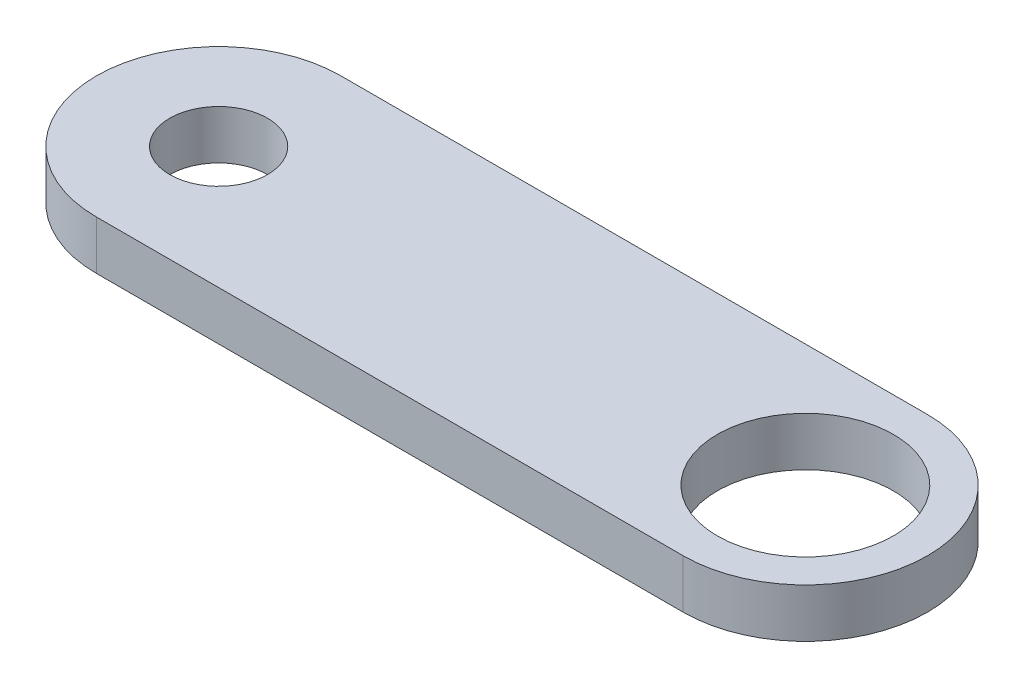
ISO-10303-21;
HEADER;
FILE_DESCRIPTION(('STEP AP214'),'2;1');
FILE_NAME('part.step','',(''),(''),'','','');
FILE_SCHEMA(('AUTOMOTIVE_DESIGN { 1 0 10303 214 1 1 1 1 }'));
ENDSEC;
DATA;
#1=APPLICATION_CONTEXT('core data for automotive mechanical design processes');
#2=APPLICATION_PROTOCOL_DEFINITION('international standard','automotive_design',2000,#1);
#3=PRODUCT_CONTEXT('',#1,'mechanical');
#4=PRODUCT('Part','Part','',(#3));
#5=PRODUCT_RELATED_PRODUCT_CATEGORY('part','',(#4));
#6=PRODUCT_DEFINITION_FORMATION('','',#4);
#7=PRODUCT_DEFINITION_CONTEXT('part definition',#1,'design');
#8=PRODUCT_DEFINITION('design','',#6,#7);
#9=PRODUCT_DEFINITION_SHAPE('','',#8);
#10=(LENGTH_UNIT() NAMED_UNIT(*) SI_UNIT(.MILLI.,.METRE.));
#11=(NAMED_UNIT(*) PLANE_ANGLE_UNIT() SI_UNIT($,.RADIAN.));
#12=(NAMED_UNIT(*) SI_UNIT($,.STERADIAN.) SOLID_ANGLE_UNIT());
#13=UNCERTAINTY_MEASURE_WITH_UNIT(LENGTH_MEASURE(1.E-05),#10,'distance_accuracy_value','');
#14=(GEOMETRIC_REPRESENTATION_CONTEXT(3) GLOBAL_UNCERTAINTY_ASSIGNED_CONTEXT((#13)) GLOBAL_UNIT_ASSIGNED_CONTEXT((#10,
#11,#12)) REPRESENTATION_CONTEXT('',''));
#15=CARTESIAN_POINT('',(0.,0.,0.));
#16=DIRECTION('',(0.,0.,1.));
#17=DIRECTION('',(1.,0.,0.));
#18=AXIS2_PLACEMENT_3D('',#15,#16,#17);
#19=CARTESIAN_POINT('',(0.,5.,0.));
#20=DIRECTION('',(0.,1.,0.));
#21=DIRECTION('',(0.,0.,1.));
#22=AXIS2_PLACEMENT_3D('',#19,#20,#21);
#23=PLANE('',#22);
#24=CARTESIAN_POINT('',(0.,5.,0.));
#25=DIRECTION('',(0.,1.,0.));
#26=DIRECTION('',(0.,0.,1.));
#27=AXIS2_PLACEMENT_3D('',#24,#25,#26);
#28=CIRCLE('',#27,5.);
#29=CARTESIAN_POINT('',(0.,5.,5.));
#30=VERTEX_POINT('',#29);
#31=EDGE_CURVE('E112',#30,#30,#28,.T.);
#32=ORIENTED_EDGE('',*,*,#31,.F.);
#33=EDGE_LOOP('',(#32));
#34=FACE_BOUND('',#33,.T.);
#35=CARTESIAN_POINT('',(0.,5.,0.));
#36=DIRECTION('',(0.,1.,0.));
#37=DIRECTION('',(0.,0.,1.));
#38=AXIS2_PLACEMENT_3D('',#35,#36,#37);
#39=CIRCLE('',#38,12.5);
#40=CARTESIAN_POINT('',(0.,5.,-12.5));
#41=VERTEX_POINT('',#40);
#42=CARTESIAN_POINT('',(0.,5.,12.5));
#43=VERTEX_POINT('',#42);
#44=EDGE_CURVE('E92',#41,#43,#39,.T.);
#45=ORIENTED_EDGE('',*,*,#44,.T.);
#46=DIRECTION('',(1.,0.,0.));
#47=VECTOR('',#46,1.);
#48=CARTESIAN_POINT('',(0.,5.,12.5));
#49=LINE('',#48,#47);
#50=CARTESIAN_POINT('',(60.,5.,12.5));
#51=VERTEX_POINT('',#50);
#52=EDGE_CURVE('E87',#43,#51,#49,.T.);
#53=ORIENTED_EDGE('',*,*,#52,.T.);
#54=CARTESIAN_POINT('',(60.,5.,0.));
#55=DIRECTION('',(0.,1.,0.));
#56=DIRECTION('',(0.,0.,1.));
#57=AXIS2_PLACEMENT_3D('',#54,#55,#56);
#58=CIRCLE('',#57,12.5);
#59=CARTESIAN_POINT('',(60.,5.,-12.5));
#60=VERTEX_POINT('',#59);
#61=EDGE_CURVE('E90',#51,#60,#58,.T.);
#62=ORIENTED_EDGE('',*,*,#61,.T.);
#63=DIRECTION('',(-1.,0.,0.));
#64=VECTOR('',#63,1.);
#65=CARTESIAN_POINT('',(0.,5.,-12.5));
#66=LINE('',#65,#64);
#67=EDGE_CURVE('E57',#60,#41,#66,.T.);
#68=ORIENTED_EDGE('',*,*,#67,.T.);
#69=EDGE_LOOP('',(#45,#53,#62,#68));
#70=FACE_BOUND('',#69,.T.);
#71=CARTESIAN_POINT('',(60.,5.,0.));
#72=DIRECTION('',(0.,1.,0.));
#73=DIRECTION('',(0.,0.,1.));
#74=AXIS2_PLACEMENT_3D('',#71,#72,#73);
#75=CIRCLE('',#74,9.00000000000001);
#76=CARTESIAN_POINT('',(60.,5.,9.00000000000001));
#77=VERTEX_POINT('',#76);
#78=EDGE_CURVE('E134',#77,#77,#75,.T.);
#79=ORIENTED_EDGE('',*,*,#78,.F.);
#80=EDGE_LOOP('',(#79));
#81=FACE_BOUND('',#80,.T.);
#82=ADVANCED_FACE('F39',(#34,#70,#81),#23,.T.);
#83=CARTESIAN_POINT('',(0.,0.,0.));
#84=DIRECTION('',(0.,1.,0.));
#85=DIRECTION('',(0.,0.,1.));
#86=AXIS2_PLACEMENT_3D('',#83,#84,#85);
#87=PLANE('',#86);
#88=CARTESIAN_POINT('',(0.,0.,0.));
#89=DIRECTION('',(0.,1.,0.));
#90=DIRECTION('',(0.,0.,1.));
#91=AXIS2_PLACEMENT_3D('',#88,#89,#90);
#92=CIRCLE('',#91,12.5);
#93=CARTESIAN_POINT('',(0.,0.,-12.5));
#94=VERTEX_POINT('',#93);
#95=CARTESIAN_POINT('',(0.,0.,12.5));
#96=VERTEX_POINT('',#95);
#97=EDGE_CURVE('E108',#94,#96,#92,.T.);
#98=ORIENTED_EDGE('',*,*,#97,.F.);
#99=DIRECTION('',(-1.,0.,0.));
#100=VECTOR('',#99,1.);
#101=CARTESIAN_POINT('',(0.,0.,-12.5));
#102=LINE('',#101,#100);
#103=CARTESIAN_POINT('',(60.,0.,-12.5));
#104=VERTEX_POINT('',#103);
#105=EDGE_CURVE('E80',#104,#94,#102,.T.);
#106=ORIENTED_EDGE('',*,*,#105,.F.);
#107=CARTESIAN_POINT('',(60.,0.,0.));
#108=DIRECTION('',(0.,1.,0.));
#109=DIRECTION('',(0.,0.,1.));
#110=AXIS2_PLACEMENT_3D('',#107,#108,#109);
#111=CIRCLE('',#110,12.5);
#112=CARTESIAN_POINT('',(60.,0.,12.5));
#113=VERTEX_POINT('',#112);
#114=EDGE_CURVE('E74',#113,#104,#111,.T.);
#115=ORIENTED_EDGE('',*,*,#114,.F.);
#116=DIRECTION('',(1.,0.,0.));
#117=VECTOR('',#116,1.);
#118=CARTESIAN_POINT('',(0.,0.,12.5));
#119=LINE('',#118,#117);
#120=EDGE_CURVE('E97',#96,#113,#119,.T.);
#121=ORIENTED_EDGE('',*,*,#120,.F.);
#122=EDGE_LOOP('',(#98,#106,#115,#121));
#123=FACE_BOUND('',#122,.T.);
#124=CARTESIAN_POINT('',(0.,0.,0.));
#125=DIRECTION('',(0.,1.,0.));
#126=DIRECTION('',(0.,0.,1.));
#127=AXIS2_PLACEMENT_3D('',#124,#125,#126);
#128=CIRCLE('',#127,5.);
#129=CARTESIAN_POINT('',(0.,0.,5.));
#130=VERTEX_POINT('',#129);
#131=EDGE_CURVE('E130',#130,#130,#128,.T.);
#132=ORIENTED_EDGE('',*,*,#131,.T.);
#133=EDGE_LOOP('',(#132));
#134=FACE_BOUND('',#133,.T.);
#135=CARTESIAN_POINT('',(60.,0.,0.));
#136=DIRECTION('',(0.,1.,0.));
#137=DIRECTION('',(0.,0.,1.));
#138=AXIS2_PLACEMENT_3D('',#135,#136,#137);
#139=CIRCLE('',#138,9.00000000000001);
#140=CARTESIAN_POINT('',(60.,0.,9.00000000000001));
#141=VERTEX_POINT('',#140);
#142=EDGE_CURVE('E138',#141,#141,#139,.T.);
#143=ORIENTED_EDGE('',*,*,#142,.T.);
#144=EDGE_LOOP('',(#143));
#145=FACE_BOUND('',#144,.T.);
#146=ADVANCED_FACE('F125',(#123,#134,#145),#87,.F.);
#147=CARTESIAN_POINT('',(0.,5.,0.));
#148=DIRECTION('',(0.,-1.,0.));
#149=DIRECTION('',(0.,0.,-1.));
#150=AXIS2_PLACEMENT_3D('',#147,#148,#149);
#151=CYLINDRICAL_SURFACE('',#150,12.5);
#152=ORIENTED_EDGE('',*,*,#97,.T.);
#153=DIRECTION('',(0.,-1.,0.));
#154=VECTOR('',#153,1.);
#155=CARTESIAN_POINT('',(0.,5.,12.5));
#156=LINE('',#155,#154);
#157=EDGE_CURVE('E11',#43,#96,#156,.T.);
#158=ORIENTED_EDGE('',*,*,#157,.F.);
#159=ORIENTED_EDGE('',*,*,#44,.F.);
#160=DIRECTION('',(0.,-1.,0.));
#161=VECTOR('',#160,1.);
#162=CARTESIAN_POINT('',(0.,5.,-12.5));
#163=LINE('',#162,#161);
#164=EDGE_CURVE('E104',#41,#94,#163,.T.);
#165=ORIENTED_EDGE('',*,*,#164,.T.);
#166=EDGE_LOOP('',(#152,#158,#159,#165));
#167=FACE_BOUND('',#166,.T.);
#168=ADVANCED_FACE('F41',(#167),#151,.T.);
#169=CARTESIAN_POINT('',(0.,5.,12.5));
#170=DIRECTION('',(0.,0.,-1.));
#171=DIRECTION('',(-1.,0.,0.));
#172=AXIS2_PLACEMENT_3D('',#169,#170,#171);
#173=PLANE('',#172);
#174=ORIENTED_EDGE('',*,*,#120,.T.);
#175=DIRECTION('',(0.,-1.,0.));
#176=VECTOR('',#175,1.);
#177=CARTESIAN_POINT('',(60.,5.,12.5));
#178=LINE('',#177,#176);
#179=EDGE_CURVE('E49',#51,#113,#178,.T.);
#180=ORIENTED_EDGE('',*,*,#179,.F.);
#181=ORIENTED_EDGE('',*,*,#52,.F.);
#182=ORIENTED_EDGE('',*,*,#157,.T.);
#183=EDGE_LOOP('',(#174,#180,#181,#182));
#184=FACE_BOUND('',#183,.T.);
#185=ADVANCED_FACE('F96',(#184),#173,.F.);
#186=CARTESIAN_POINT('',(60.,5.,0.));
#187=DIRECTION('',(0.,-1.,0.));
#188=DIRECTION('',(0.,0.,-1.));
#189=AXIS2_PLACEMENT_3D('',#186,#187,#188);
#190=CYLINDRICAL_SURFACE('',#189,12.5);
#191=ORIENTED_EDGE('',*,*,#114,.T.);
#192=DIRECTION('',(0.,-1.,0.));
#193=VECTOR('',#192,1.);
#194=CARTESIAN_POINT('',(60.,5.,-12.5));
#195=LINE('',#194,#193);
#196=EDGE_CURVE('E99',#60,#104,#195,.T.);
#197=ORIENTED_EDGE('',*,*,#196,.F.);
#198=ORIENTED_EDGE('',*,*,#61,.F.);
#199=ORIENTED_EDGE('',*,*,#179,.T.);
#200=EDGE_LOOP('',(#191,#197,#198,#199));
#201=FACE_BOUND('',#200,.T.);
#202=ADVANCED_FACE('F100',(#201),#190,.T.);
#203=CARTESIAN_POINT('',(0.,5.,-12.5));
#204=DIRECTION('',(0.,0.,1.));
#205=DIRECTION('',(1.,0.,0.));
#206=AXIS2_PLACEMENT_3D('',#203,#204,#205);
#207=PLANE('',#206);
#208=ORIENTED_EDGE('',*,*,#105,.T.);
#209=ORIENTED_EDGE('',*,*,#164,.F.);
#210=ORIENTED_EDGE('',*,*,#67,.F.);
#211=ORIENTED_EDGE('',*,*,#196,.T.);
#212=EDGE_LOOP('',(#208,#209,#210,#211));
#213=FACE_BOUND('',#212,.T.);
#214=ADVANCED_FACE('F122',(#213),#207,.F.);
#215=CARTESIAN_POINT('',(0.,5.,0.));
#216=DIRECTION('',(0.,-1.,0.));
#217=DIRECTION('',(0.,0.,-1.));
#218=AXIS2_PLACEMENT_3D('',#215,#216,#217);
#219=CYLINDRICAL_SURFACE('',#218,5.);
#220=ORIENTED_EDGE('',*,*,#31,.T.);
#221=EDGE_LOOP('',(#220));
#222=FACE_BOUND('',#221,.T.);
#223=ORIENTED_EDGE('',*,*,#131,.F.);
#224=EDGE_LOOP('',(#223));
#225=FACE_BOUND('',#224,.T.);
#226=ADVANCED_FACE('F157',(#222,#225),#219,.F.);
#227=CARTESIAN_POINT('',(60.,5.,0.));
#228=DIRECTION('',(0.,-1.,0.));
#229=DIRECTION('',(0.,0.,-1.));
#230=AXIS2_PLACEMENT_3D('',#227,#228,#229);
#231=CYLINDRICAL_SURFACE('',#230,9.00000000000001);
#232=ORIENTED_EDGE('',*,*,#78,.T.);
#233=EDGE_LOOP('',(#232));
#234=FACE_BOUND('',#233,.T.);
#235=ORIENTED_EDGE('',*,*,#142,.F.);
#236=EDGE_LOOP('',(#235));
#237=FACE_BOUND('',#236,.T.);
#238=ADVANCED_FACE('F146',(#234,#237),#231,.F.);
#239=CLOSED_SHELL('',(#82,#146,#168,#185,#202,#214,#226,#238));
#240=MANIFOLD_SOLID_BREP('B2',#239);
#241=ADVANCED_BREP_SHAPE_REPRESENTATION('',(#18,#240),#14);
#242=SHAPE_DEFINITION_REPRESENTATION(#9,#241);
ENDSEC;
END-ISO-10303-21;
